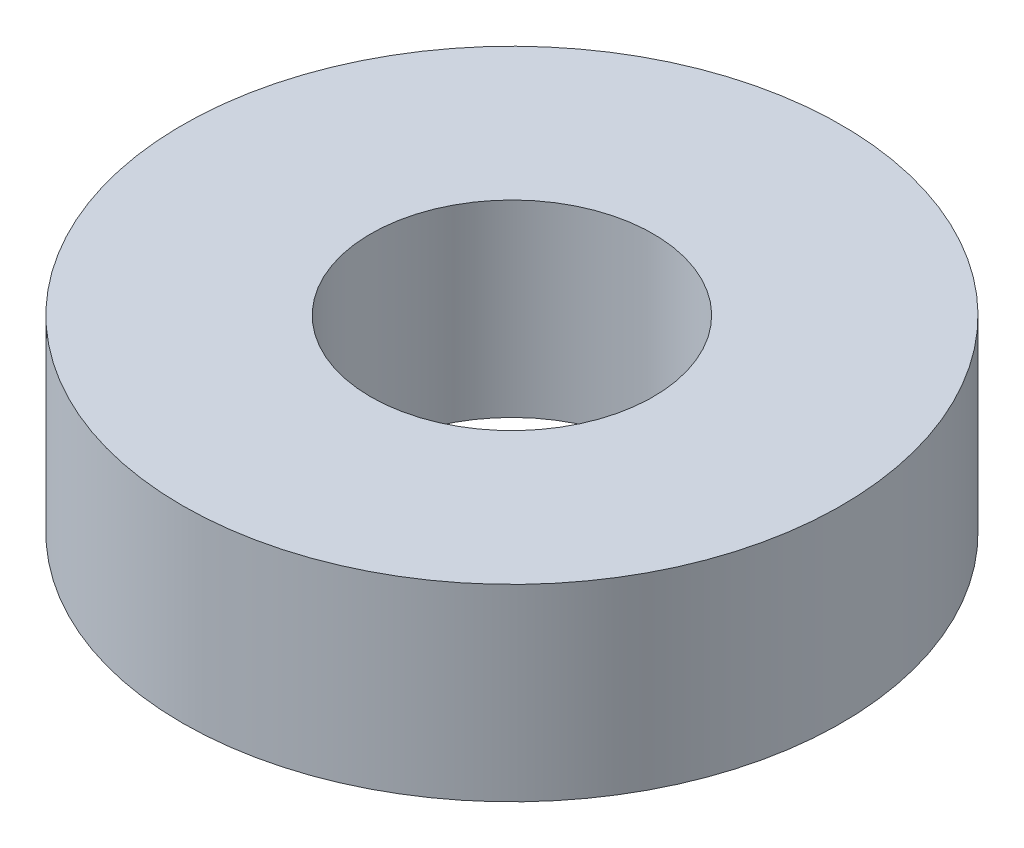
ISO-10303-21;
HEADER;
FILE_DESCRIPTION(('STEP AP214'),'2;1');
FILE_NAME('part.step','',(''),(''),'','','');
FILE_SCHEMA(('AUTOMOTIVE_DESIGN { 1 0 10303 214 1 1 1 1 }'));
ENDSEC;
DATA;
#1=APPLICATION_CONTEXT('core data for automotive mechanical design processes');
#2=APPLICATION_PROTOCOL_DEFINITION('international standard','automotive_design',2000,#1);
#3=PRODUCT_CONTEXT('',#1,'mechanical');
#4=PRODUCT('Part','Part','',(#3));
#5=PRODUCT_RELATED_PRODUCT_CATEGORY('part','',(#4));
#6=PRODUCT_DEFINITION_FORMATION('','',#4);
#7=PRODUCT_DEFINITION_CONTEXT('part definition',#1,'design');
#8=PRODUCT_DEFINITION('design','',#6,#7);
#9=PRODUCT_DEFINITION_SHAPE('','',#8);
#10=(LENGTH_UNIT() NAMED_UNIT(*) SI_UNIT(.MILLI.,.METRE.));
#11=(NAMED_UNIT(*) PLANE_ANGLE_UNIT() SI_UNIT($,.RADIAN.));
#12=(NAMED_UNIT(*) SI_UNIT($,.STERADIAN.) SOLID_ANGLE_UNIT());
#13=UNCERTAINTY_MEASURE_WITH_UNIT(LENGTH_MEASURE(1.E-05),#10,'distance_accuracy_value','');
#14=(GEOMETRIC_REPRESENTATION_CONTEXT(3) GLOBAL_UNCERTAINTY_ASSIGNED_CONTEXT((#13)) GLOBAL_UNIT_ASSIGNED_CONTEXT((#10,
#11,#12)) REPRESENTATION_CONTEXT('',''));
#15=CARTESIAN_POINT('',(0.,0.,0.));
#16=DIRECTION('',(0.,0.,1.));
#17=DIRECTION('',(1.,0.,0.));
#18=AXIS2_PLACEMENT_3D('',#15,#16,#17);
#19=CARTESIAN_POINT('',(0.,2.,0.));
#20=DIRECTION('',(0.,1.,0.));
#21=DIRECTION('',(0.,0.,1.));
#22=AXIS2_PLACEMENT_3D('',#19,#20,#21);
#23=PLANE('',#22);
#24=CARTESIAN_POINT('',(0.,2.,0.));
#25=DIRECTION('',(0.,1.,0.));
#26=DIRECTION('',(0.,0.,1.));
#27=AXIS2_PLACEMENT_3D('',#24,#25,#26);
#28=CIRCLE('',#27,3.5);
#29=CARTESIAN_POINT('',(0.,2.,3.5));
#30=VERTEX_POINT('',#29);
#31=EDGE_CURVE('E10',#30,#30,#28,.T.);
#32=ORIENTED_EDGE('',*,*,#31,.T.);
#33=EDGE_LOOP('',(#32));
#34=FACE_BOUND('',#33,.T.);
#35=CARTESIAN_POINT('',(0.,2.,0.));
#36=DIRECTION('',(0.,1.,0.));
#37=DIRECTION('',(0.,0.,1.));
#38=AXIS2_PLACEMENT_3D('',#35,#36,#37);
#39=CIRCLE('',#38,1.5);
#40=CARTESIAN_POINT('',(0.,2.,1.5));
#41=VERTEX_POINT('',#40);
#42=EDGE_CURVE('E50',#41,#41,#39,.T.);
#43=ORIENTED_EDGE('',*,*,#42,.F.);
#44=EDGE_LOOP('',(#43));
#45=FACE_BOUND('',#44,.T.);
#46=ADVANCED_FACE('F37',(#34,#45),#23,.T.);
#47=CARTESIAN_POINT('',(0.,0.,0.));
#48=DIRECTION('',(0.,1.,0.));
#49=DIRECTION('',(0.,0.,1.));
#50=AXIS2_PLACEMENT_3D('',#47,#48,#49);
#51=PLANE('',#50);
#52=CARTESIAN_POINT('',(0.,0.,0.));
#53=DIRECTION('',(0.,1.,0.));
#54=DIRECTION('',(0.,0.,1.));
#55=AXIS2_PLACEMENT_3D('',#52,#53,#54);
#56=CIRCLE('',#55,3.5);
#57=CARTESIAN_POINT('',(0.,0.,3.5));
#58=VERTEX_POINT('',#57);
#59=EDGE_CURVE('E41',#58,#58,#56,.T.);
#60=ORIENTED_EDGE('',*,*,#59,.F.);
#61=EDGE_LOOP('',(#60));
#62=FACE_BOUND('',#61,.T.);
#63=CARTESIAN_POINT('',(0.,0.,0.));
#64=DIRECTION('',(0.,1.,0.));
#65=DIRECTION('',(0.,0.,1.));
#66=AXIS2_PLACEMENT_3D('',#63,#64,#65);
#67=CIRCLE('',#66,1.5);
#68=CARTESIAN_POINT('',(0.,0.,1.5));
#69=VERTEX_POINT('',#68);
#70=EDGE_CURVE('E52',#69,#69,#67,.T.);
#71=ORIENTED_EDGE('',*,*,#70,.T.);
#72=EDGE_LOOP('',(#71));
#73=FACE_BOUND('',#72,.T.);
#74=ADVANCED_FACE('F64',(#62,#73),#51,.F.);
#75=CARTESIAN_POINT('',(0.,2.,0.));
#76=DIRECTION('',(0.,-1.,0.));
#77=DIRECTION('',(0.,0.,-1.));
#78=AXIS2_PLACEMENT_3D('',#75,#76,#77);
#79=CYLINDRICAL_SURFACE('',#78,3.5);
#80=ORIENTED_EDGE('',*,*,#31,.F.);
#81=EDGE_LOOP('',(#80));
#82=FACE_BOUND('',#81,.T.);
#83=ORIENTED_EDGE('',*,*,#59,.T.);
#84=EDGE_LOOP('',(#83));
#85=FACE_BOUND('',#84,.T.);
#86=ADVANCED_FACE('F39',(#82,#85),#79,.T.);
#87=CARTESIAN_POINT('',(0.,2.,0.));
#88=DIRECTION('',(0.,-1.,0.));
#89=DIRECTION('',(0.,0.,-1.));
#90=AXIS2_PLACEMENT_3D('',#87,#88,#89);
#91=CYLINDRICAL_SURFACE('',#90,1.5);
#92=ORIENTED_EDGE('',*,*,#42,.T.);
#93=EDGE_LOOP('',(#92));
#94=FACE_BOUND('',#93,.T.);
#95=ORIENTED_EDGE('',*,*,#70,.F.);
#96=EDGE_LOOP('',(#95));
#97=FACE_BOUND('',#96,.T.);
#98=ADVANCED_FACE('F60',(#94,#97),#91,.F.);
#99=CLOSED_SHELL('',(#46,#74,#86,#98));
#100=MANIFOLD_SOLID_BREP('B2',#99);
#101=ADVANCED_BREP_SHAPE_REPRESENTATION('',(#18,#100),#14);
#102=SHAPE_DEFINITION_REPRESENTATION(#9,#101);
ENDSEC;
END-ISO-10303-21;
